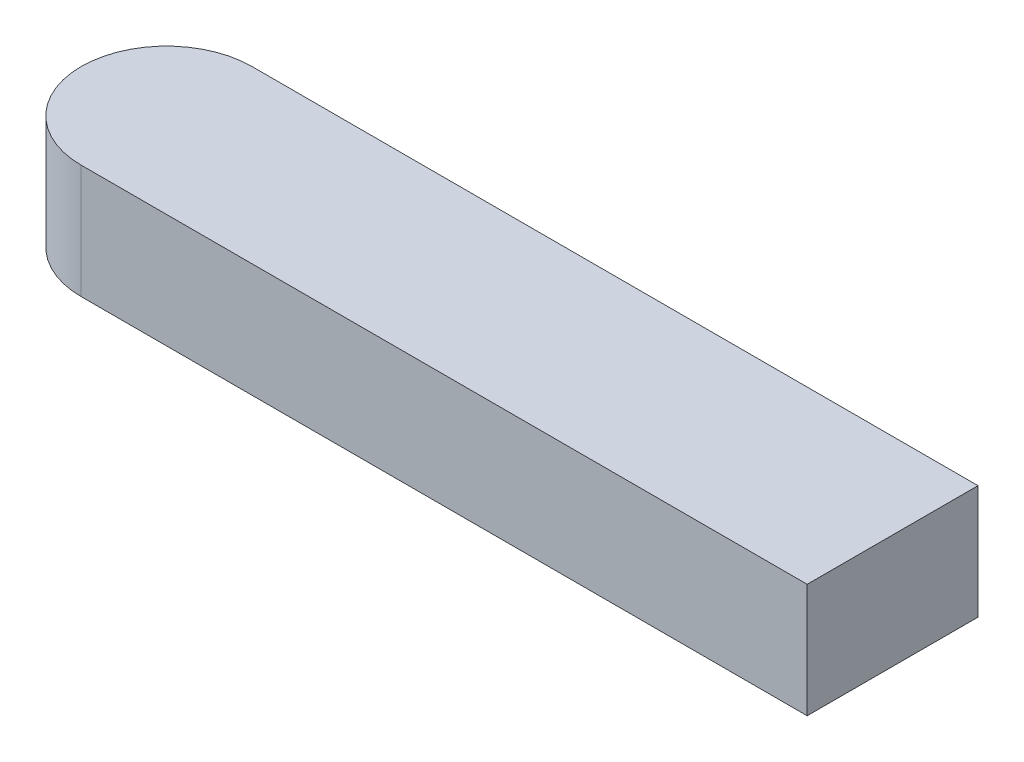
ISO-10303-21;
HEADER;
FILE_DESCRIPTION(('STEP AP214'),'2;1');
FILE_NAME('part.step','',(''),(''),'','','');
FILE_SCHEMA(('AUTOMOTIVE_DESIGN { 1 0 10303 214 1 1 1 1 }'));
ENDSEC;
DATA;
#1=APPLICATION_CONTEXT('core data for automotive mechanical design processes');
#2=APPLICATION_PROTOCOL_DEFINITION('international standard','automotive_design',2000,#1);
#3=PRODUCT_CONTEXT('',#1,'mechanical');
#4=PRODUCT('Part','Part','',(#3));
#5=PRODUCT_RELATED_PRODUCT_CATEGORY('part','',(#4));
#6=PRODUCT_DEFINITION_FORMATION('','',#4);
#7=PRODUCT_DEFINITION_CONTEXT('part definition',#1,'design');
#8=PRODUCT_DEFINITION('design','',#6,#7);
#9=PRODUCT_DEFINITION_SHAPE('','',#8);
#10=(LENGTH_UNIT() NAMED_UNIT(*) SI_UNIT(.MILLI.,.METRE.));
#11=(NAMED_UNIT(*) PLANE_ANGLE_UNIT() SI_UNIT($,.RADIAN.));
#12=(NAMED_UNIT(*) SI_UNIT($,.STERADIAN.) SOLID_ANGLE_UNIT());
#13=UNCERTAINTY_MEASURE_WITH_UNIT(LENGTH_MEASURE(1.E-05),#10,'distance_accuracy_value','');
#14=(GEOMETRIC_REPRESENTATION_CONTEXT(3) GLOBAL_UNCERTAINTY_ASSIGNED_CONTEXT((#13)) GLOBAL_UNIT_ASSIGNED_CONTEXT((#10,
#11,#12)) REPRESENTATION_CONTEXT('',''));
#15=CARTESIAN_POINT('',(0.,0.,0.));
#16=DIRECTION('',(0.,0.,1.));
#17=DIRECTION('',(1.,0.,0.));
#18=AXIS2_PLACEMENT_3D('',#15,#16,#17);
#19=CARTESIAN_POINT('',(-14.2702702702703,4.,0.));
#20=DIRECTION('',(0.,-1.,0.));
#21=DIRECTION('',(0.,0.,-1.));
#22=AXIS2_PLACEMENT_3D('',#19,#20,#21);
#23=CYLINDRICAL_SURFACE('',#22,6.);
#24=CARTESIAN_POINT('',(-14.2702702702703,-4.,0.));
#25=DIRECTION('',(0.,1.,0.));
#26=DIRECTION('',(0.,0.,1.));
#27=AXIS2_PLACEMENT_3D('',#24,#25,#26);
#28=CIRCLE('',#27,6.);
#29=CARTESIAN_POINT('',(-14.2702702702703,-4.,-5.99999999999998));
#30=VERTEX_POINT('',#29);
#31=CARTESIAN_POINT('',(-14.2702702702703,-4.,6.00000000000002));
#32=VERTEX_POINT('',#31);
#33=EDGE_CURVE('E95',#30,#32,#28,.T.);
#34=ORIENTED_EDGE('',*,*,#33,.T.);
#35=DIRECTION('',(0.,-1.,0.));
#36=VECTOR('',#35,1.);
#37=CARTESIAN_POINT('',(-14.2702702702703,4.,6.));
#38=LINE('',#37,#36);
#39=CARTESIAN_POINT('',(-14.2702702702703,4.,6.));
#40=VERTEX_POINT('',#39);
#41=EDGE_CURVE('E11',#40,#32,#38,.T.);
#42=ORIENTED_EDGE('',*,*,#41,.F.);
#43=CARTESIAN_POINT('',(-14.2702702702703,4.,0.));
#44=DIRECTION('',(0.,1.,0.));
#45=DIRECTION('',(0.,0.,1.));
#46=AXIS2_PLACEMENT_3D('',#43,#44,#45);
#47=CIRCLE('',#46,6.);
#48=CARTESIAN_POINT('',(-14.2702702702703,4.,-6.));
#49=VERTEX_POINT('',#48);
#50=EDGE_CURVE('E83',#49,#40,#47,.T.);
#51=ORIENTED_EDGE('',*,*,#50,.F.);
#52=DIRECTION('',(0.,-1.,0.));
#53=VECTOR('',#52,1.);
#54=CARTESIAN_POINT('',(-14.2702702702703,4.,-6.));
#55=LINE('',#54,#53);
#56=EDGE_CURVE('E91',#49,#30,#55,.T.);
#57=ORIENTED_EDGE('',*,*,#56,.T.);
#58=EDGE_LOOP('',(#34,#42,#51,#57));
#59=FACE_BOUND('',#58,.T.);
#60=ADVANCED_FACE('F32',(#59),#23,.T.);
#61=CARTESIAN_POINT('',(-14.2702702702703,4.,6.));
#62=DIRECTION('',(0.,0.,-1.));
#63=DIRECTION('',(-1.,0.,0.));
#64=AXIS2_PLACEMENT_3D('',#61,#62,#63);
#65=PLANE('',#64);
#66=DIRECTION('',(1.,0.,0.));
#67=VECTOR('',#66,1.);
#68=CARTESIAN_POINT('',(-14.2702702702703,-4.,6.00000000000002));
#69=LINE('',#68,#67);
#70=CARTESIAN_POINT('',(36.7297297297297,-4.,6.));
#71=VERTEX_POINT('',#70);
#72=EDGE_CURVE('E87',#32,#71,#69,.T.);
#73=ORIENTED_EDGE('',*,*,#72,.T.);
#74=DIRECTION('',(0.,-1.,0.));
#75=VECTOR('',#74,1.);
#76=CARTESIAN_POINT('',(36.7297297297297,4.,6.));
#77=LINE('',#76,#75);
#78=CARTESIAN_POINT('',(36.7297297297297,4.,6.));
#79=VERTEX_POINT('',#78);
#80=EDGE_CURVE('E40',#79,#71,#77,.T.);
#81=ORIENTED_EDGE('',*,*,#80,.F.);
#82=DIRECTION('',(1.,0.,0.));
#83=VECTOR('',#82,1.);
#84=CARTESIAN_POINT('',(-14.2702702702703,4.,6.));
#85=LINE('',#84,#83);
#86=EDGE_CURVE('E78',#40,#79,#85,.T.);
#87=ORIENTED_EDGE('',*,*,#86,.F.);
#88=ORIENTED_EDGE('',*,*,#41,.T.);
#89=EDGE_LOOP('',(#73,#81,#87,#88));
#90=FACE_BOUND('',#89,.T.);
#91=ADVANCED_FACE('F86',(#90),#65,.F.);
#92=CARTESIAN_POINT('',(36.7297297297297,4.,6.));
#93=DIRECTION('',(-1.,0.,0.));
#94=DIRECTION('',(0.,0.,1.));
#95=AXIS2_PLACEMENT_3D('',#92,#93,#94);
#96=PLANE('',#95);
#97=DIRECTION('',(0.,0.,-1.));
#98=VECTOR('',#97,1.);
#99=CARTESIAN_POINT('',(36.7297297297297,-4.,6.));
#100=LINE('',#99,#98);
#101=CARTESIAN_POINT('',(36.7297297297297,-4.,-6.));
#102=VERTEX_POINT('',#101);
#103=EDGE_CURVE('E65',#71,#102,#100,.T.);
#104=ORIENTED_EDGE('',*,*,#103,.T.);
#105=DIRECTION('',(0.,-1.,0.));
#106=VECTOR('',#105,1.);
#107=CARTESIAN_POINT('',(36.7297297297297,4.,-6.));
#108=LINE('',#107,#106);
#109=CARTESIAN_POINT('',(36.7297297297297,4.,-6.));
#110=VERTEX_POINT('',#109);
#111=EDGE_CURVE('E88',#110,#102,#108,.T.);
#112=ORIENTED_EDGE('',*,*,#111,.F.);
#113=DIRECTION('',(0.,0.,-1.));
#114=VECTOR('',#113,1.);
#115=CARTESIAN_POINT('',(36.7297297297297,4.,6.));
#116=LINE('',#115,#114);
#117=EDGE_CURVE('E81',#79,#110,#116,.T.);
#118=ORIENTED_EDGE('',*,*,#117,.F.);
#119=ORIENTED_EDGE('',*,*,#80,.T.);
#120=EDGE_LOOP('',(#104,#112,#118,#119));
#121=FACE_BOUND('',#120,.T.);
#122=ADVANCED_FACE('F89',(#121),#96,.F.);
#123=CARTESIAN_POINT('',(-14.2702702702703,4.,-6.));
#124=DIRECTION('',(0.,0.,1.));
#125=DIRECTION('',(1.,0.,0.));
#126=AXIS2_PLACEMENT_3D('',#123,#124,#125);
#127=PLANE('',#126);
#128=DIRECTION('',(-1.,0.,0.));
#129=VECTOR('',#128,1.);
#130=CARTESIAN_POINT('',(-14.2702702702703,-4.,-5.99999999999998));
#131=LINE('',#130,#129);
#132=EDGE_CURVE('E71',#102,#30,#131,.T.);
#133=ORIENTED_EDGE('',*,*,#132,.T.);
#134=ORIENTED_EDGE('',*,*,#56,.F.);
#135=DIRECTION('',(-1.,0.,0.));
#136=VECTOR('',#135,1.);
#137=CARTESIAN_POINT('',(-14.2702702702703,4.,-6.));
#138=LINE('',#137,#136);
#139=EDGE_CURVE('E48',#110,#49,#138,.T.);
#140=ORIENTED_EDGE('',*,*,#139,.F.);
#141=ORIENTED_EDGE('',*,*,#111,.T.);
#142=EDGE_LOOP('',(#133,#134,#140,#141));
#143=FACE_BOUND('',#142,.T.);
#144=ADVANCED_FACE('F102',(#143),#127,.F.);
#145=CARTESIAN_POINT('',(-14.2702702702703,4.,0.));
#146=DIRECTION('',(0.,1.,0.));
#147=DIRECTION('',(0.,0.,1.));
#148=AXIS2_PLACEMENT_3D('',#145,#146,#147);
#149=PLANE('',#148);
#150=ORIENTED_EDGE('',*,*,#50,.T.);
#151=ORIENTED_EDGE('',*,*,#86,.T.);
#152=ORIENTED_EDGE('',*,*,#117,.T.);
#153=ORIENTED_EDGE('',*,*,#139,.T.);
#154=EDGE_LOOP('',(#150,#151,#152,#153));
#155=FACE_BOUND('',#154,.T.);
#156=ADVANCED_FACE('F79',(#155),#149,.T.);
#157=CARTESIAN_POINT('',(-14.2702702702703,-4.,0.));
#158=DIRECTION('',(0.,1.,0.));
#159=DIRECTION('',(0.,0.,1.));
#160=AXIS2_PLACEMENT_3D('',#157,#158,#159);
#161=PLANE('',#160);
#162=ORIENTED_EDGE('',*,*,#33,.F.);
#163=ORIENTED_EDGE('',*,*,#132,.F.);
#164=ORIENTED_EDGE('',*,*,#103,.F.);
#165=ORIENTED_EDGE('',*,*,#72,.F.);
#166=EDGE_LOOP('',(#162,#163,#164,#165));
#167=FACE_BOUND('',#166,.T.);
#168=ADVANCED_FACE('F105',(#167),#161,.F.);
#169=CLOSED_SHELL('',(#60,#91,#122,#144,#156,#168));
#170=MANIFOLD_SOLID_BREP('B2',#169);
#171=ADVANCED_BREP_SHAPE_REPRESENTATION('',(#18,#170),#14);
#172=SHAPE_DEFINITION_REPRESENTATION(#9,#171);
ENDSEC;
END-ISO-10303-21;
